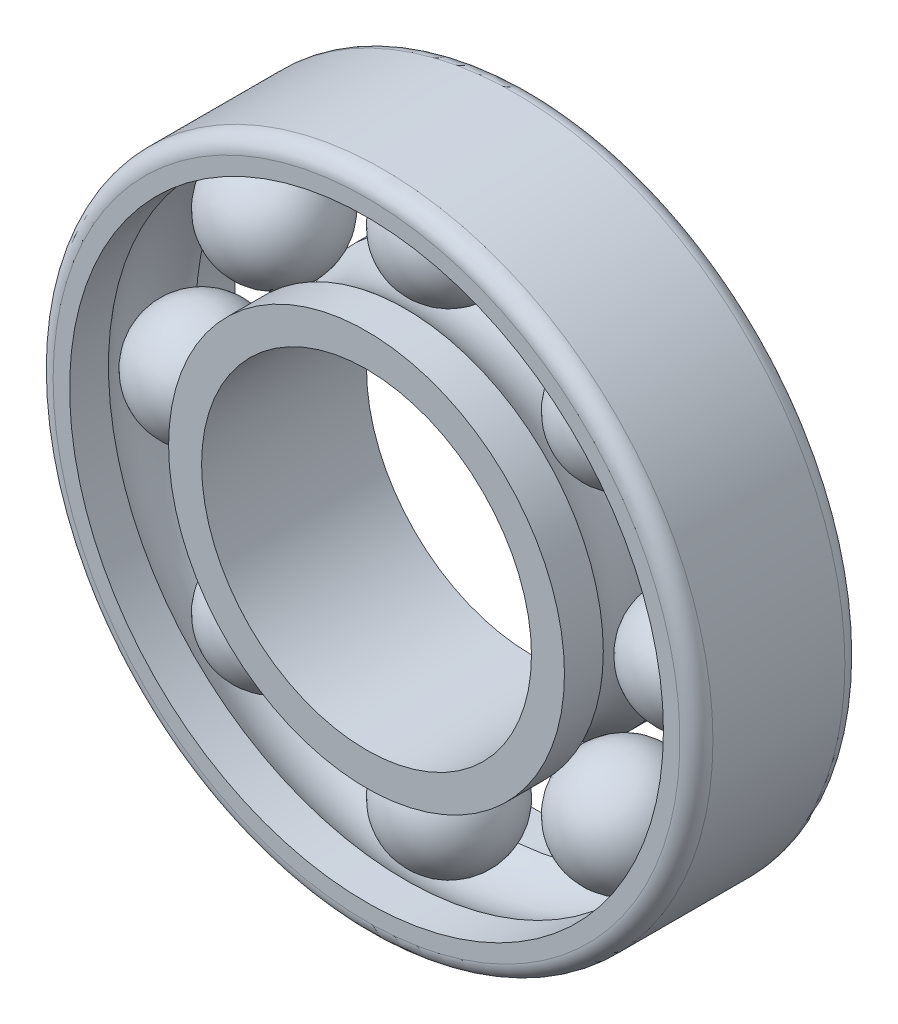
ISO-10303-21;
HEADER;
FILE_DESCRIPTION(('STEP AP214'),'2;1');
FILE_NAME('part.step','',(''),(''),'','','');
FILE_SCHEMA(('AUTOMOTIVE_DESIGN { 1 0 10303 214 1 1 1 1 }'));
ENDSEC;
DATA;
#1=APPLICATION_CONTEXT('core data for automotive mechanical design processes');
#2=APPLICATION_PROTOCOL_DEFINITION('international standard','automotive_design',2000,#1);
#3=PRODUCT_CONTEXT('',#1,'mechanical');
#4=PRODUCT('Part','Part','',(#3));
#5=PRODUCT_RELATED_PRODUCT_CATEGORY('part','',(#4));
#6=PRODUCT_DEFINITION_FORMATION('','',#4);
#7=PRODUCT_DEFINITION_CONTEXT('part definition',#1,'design');
#8=PRODUCT_DEFINITION('design','',#6,#7);
#9=PRODUCT_DEFINITION_SHAPE('','',#8);
#10=(LENGTH_UNIT() NAMED_UNIT(*) SI_UNIT(.MILLI.,.METRE.));
#11=(NAMED_UNIT(*) PLANE_ANGLE_UNIT() SI_UNIT($,.RADIAN.));
#12=(NAMED_UNIT(*) SI_UNIT($,.STERADIAN.) SOLID_ANGLE_UNIT());
#13=UNCERTAINTY_MEASURE_WITH_UNIT(LENGTH_MEASURE(1.E-05),#10,'distance_accuracy_value','');
#14=(GEOMETRIC_REPRESENTATION_CONTEXT(3) GLOBAL_UNCERTAINTY_ASSIGNED_CONTEXT((#13)) GLOBAL_UNIT_ASSIGNED_CONTEXT((#10,
#11,#12)) REPRESENTATION_CONTEXT('',''));
#15=CARTESIAN_POINT('',(0.,0.,0.));
#16=DIRECTION('',(0.,0.,1.));
#17=DIRECTION('',(1.,0.,0.));
#18=AXIS2_PLACEMENT_3D('',#15,#16,#17);
#19=CARTESIAN_POINT('',(-1.06066017177983,-1.06066017177981,0.));
#20=DIRECTION('',(0.,0.,-1.));
#21=DIRECTION('',(0.707106781186556,0.707106781186539,0.));
#22=AXIS2_PLACEMENT_3D('',#19,#20,#21);
#23=SPHERICAL_SURFACE('',#22,0.354562900648627);
#24=CARTESIAN_POINT('',(-1.06066017177983,-1.06066017177981,-0.354562900648627));
#25=VERTEX_POINT('',#24);
#26=VERTEX_LOOP('',#25);
#27=FACE_BOUND('',#26,.T.);
#28=ADVANCED_FACE('F48',(#27),#23,.T.);
#29=CLOSED_SHELL('',(#28));
#30=MANIFOLD_SOLID_BREP('B2',#29);
#31=CARTESIAN_POINT('',(0.,-1.5,0.));
#32=DIRECTION('',(0.,0.,-1.));
#33=DIRECTION('',(0.,1.,0.));
#34=AXIS2_PLACEMENT_3D('',#31,#32,#33);
#35=SPHERICAL_SURFACE('',#34,0.354562900648627);
#36=CARTESIAN_POINT('',(0.,-1.5,-0.354562900648627));
#37=VERTEX_POINT('',#36);
#38=VERTEX_LOOP('',#37);
#39=FACE_BOUND('',#38,.T.);
#40=ADVANCED_FACE('F67',(#39),#35,.T.);
#41=CLOSED_SHELL('',(#40));
#42=MANIFOLD_SOLID_BREP('B6',#41);
#43=CARTESIAN_POINT('',(1.06066017177981,-1.06066017177983,0.));
#44=DIRECTION('',(0.,0.,-1.));
#45=DIRECTION('',(-0.707106781186541,0.707106781186554,0.));
#46=AXIS2_PLACEMENT_3D('',#43,#44,#45);
#47=SPHERICAL_SURFACE('',#46,0.354562900648627);
#48=CARTESIAN_POINT('',(1.06066017177981,-1.06066017177983,-0.354562900648627));
#49=VERTEX_POINT('',#48);
#50=VERTEX_LOOP('',#49);
#51=FACE_BOUND('',#50,.T.);
#52=ADVANCED_FACE('F86',(#51),#47,.T.);
#53=CLOSED_SHELL('',(#52));
#54=MANIFOLD_SOLID_BREP('B44',#53);
#55=CARTESIAN_POINT('',(1.5,0.,0.));
#56=DIRECTION('',(0.,0.,-1.));
#57=DIRECTION('',(-1.,0.,0.));
#58=AXIS2_PLACEMENT_3D('',#55,#56,#57);
#59=SPHERICAL_SURFACE('',#58,0.354562900648627);
#60=CARTESIAN_POINT('',(1.5,0.,-0.354562900648627));
#61=VERTEX_POINT('',#60);
#62=VERTEX_LOOP('',#61);
#63=FACE_BOUND('',#62,.T.);
#64=ADVANCED_FACE('F105',(#63),#59,.T.);
#65=CLOSED_SHELL('',(#64));
#66=MANIFOLD_SOLID_BREP('B63',#65);
#67=CARTESIAN_POINT('',(1.06066017177983,1.06066017177982,0.));
#68=DIRECTION('',(0.,0.,-1.));
#69=DIRECTION('',(-0.707106781186551,-0.707106781186544,0.));
#70=AXIS2_PLACEMENT_3D('',#67,#68,#69);
#71=SPHERICAL_SURFACE('',#70,0.354562900648627);
#72=CARTESIAN_POINT('',(1.06066017177983,1.06066017177982,-0.354562900648627));
#73=VERTEX_POINT('',#72);
#74=VERTEX_LOOP('',#73);
#75=FACE_BOUND('',#74,.T.);
#76=ADVANCED_FACE('F124',(#75),#71,.T.);
#77=CLOSED_SHELL('',(#76));
#78=MANIFOLD_SOLID_BREP('B82',#77);
#79=CARTESIAN_POINT('',(0.,1.5,0.));
#80=DIRECTION('',(0.,0.,-1.));
#81=DIRECTION('',(0.,-1.,0.));
#82=AXIS2_PLACEMENT_3D('',#79,#80,#81);
#83=SPHERICAL_SURFACE('',#82,0.354562900648627);
#84=CARTESIAN_POINT('',(0.,1.5,-0.354562900648627));
#85=VERTEX_POINT('',#84);
#86=VERTEX_LOOP('',#85);
#87=FACE_BOUND('',#86,.T.);
#88=ADVANCED_FACE('F143',(#87),#83,.T.);
#89=CLOSED_SHELL('',(#88));
#90=MANIFOLD_SOLID_BREP('B101',#89);
#91=CARTESIAN_POINT('',(-1.06066017177982,1.06066017177982,0.));
#92=DIRECTION('',(0.,0.,-1.));
#93=DIRECTION('',(0.707106781186546,-0.707106781186549,0.));
#94=AXIS2_PLACEMENT_3D('',#91,#92,#93);
#95=SPHERICAL_SURFACE('',#94,0.354562900648627);
#96=CARTESIAN_POINT('',(-1.06066017177982,1.06066017177982,-0.354562900648627));
#97=VERTEX_POINT('',#96);
#98=VERTEX_LOOP('',#97);
#99=FACE_BOUND('',#98,.T.);
#100=ADVANCED_FACE('F164',(#99),#95,.T.);
#101=CLOSED_SHELL('',(#100));
#102=MANIFOLD_SOLID_BREP('B120',#101);
#103=CARTESIAN_POINT('',(0.,0.,0.));
#104=DIRECTION('',(0.,0.,1.));
#105=DIRECTION('',(1.,0.,0.));
#106=AXIS2_PLACEMENT_3D('',#103,#104,#105);
#107=CYLINDRICAL_SURFACE('',#106,2.);
#108=CARTESIAN_POINT('',(0.,0.,0.4));
#109=DIRECTION('',(0.,0.,-1.));
#110=DIRECTION('',(-1.,0.,0.));
#111=AXIS2_PLACEMENT_3D('',#108,#109,#110);
#112=CIRCLE('',#111,2.);
#113=CARTESIAN_POINT('',(-2.,0.,0.4));
#114=VERTEX_POINT('',#113);
#115=EDGE_CURVE('E163',#114,#114,#112,.T.);
#116=ORIENTED_EDGE('',*,*,#115,.T.);
#117=EDGE_LOOP('',(#116));
#118=FACE_BOUND('',#117,.T.);
#119=CARTESIAN_POINT('',(0.,0.,-0.4));
#120=DIRECTION('',(0.,0.,1.));
#121=DIRECTION('',(1.,0.,0.));
#122=AXIS2_PLACEMENT_3D('',#119,#120,#121);
#123=CIRCLE('',#122,2.);
#124=CARTESIAN_POINT('',(2.,0.,-0.4));
#125=VERTEX_POINT('',#124);
#126=EDGE_CURVE('E200',#125,#125,#123,.T.);
#127=ORIENTED_EDGE('',*,*,#126,.T.);
#128=EDGE_LOOP('',(#127));
#129=FACE_BOUND('',#128,.T.);
#130=ADVANCED_FACE('F185',(#118,#129),#107,.T.);
#131=CARTESIAN_POINT('',(-1.8,0.,0.5));
#132=DIRECTION('',(0.,0.,-1.));
#133=DIRECTION('',(-1.,0.,0.));
#134=AXIS2_PLACEMENT_3D('',#131,#132,#133);
#135=PLANE('',#134);
#136=CARTESIAN_POINT('',(0.,0.,0.5));
#137=DIRECTION('',(0.,0.,-1.));
#138=DIRECTION('',(-1.,0.,0.));
#139=AXIS2_PLACEMENT_3D('',#136,#137,#138);
#140=CIRCLE('',#139,1.9);
#141=CARTESIAN_POINT('',(-1.9,0.,0.5));
#142=VERTEX_POINT('',#141);
#143=EDGE_CURVE('E192',#142,#142,#140,.F.);
#144=ORIENTED_EDGE('',*,*,#143,.T.);
#145=EDGE_LOOP('',(#144));
#146=FACE_BOUND('',#145,.T.);
#147=CARTESIAN_POINT('',(0.,0.,0.5));
#148=DIRECTION('',(0.,0.,1.));
#149=DIRECTION('',(1.,0.,0.));
#150=AXIS2_PLACEMENT_3D('',#147,#148,#149);
#151=CIRCLE('',#150,1.8);
#152=CARTESIAN_POINT('',(1.8,0.,0.5));
#153=VERTEX_POINT('',#152);
#154=EDGE_CURVE('E205',#153,#153,#151,.T.);
#155=ORIENTED_EDGE('',*,*,#154,.F.);
#156=EDGE_LOOP('',(#155));
#157=FACE_BOUND('',#156,.T.);
#158=ADVANCED_FACE('F235',(#146,#157),#135,.F.);
#159=CARTESIAN_POINT('',(0.,0.,0.));
#160=DIRECTION('',(0.,0.,1.));
#161=DIRECTION('',(1.,0.,0.));
#162=AXIS2_PLACEMENT_3D('',#159,#160,#161);
#163=CYLINDRICAL_SURFACE('',#162,1.8);
#164=CARTESIAN_POINT('',(0.,0.,0.264575131106459));
#165=DIRECTION('',(0.,0.,1.));
#166=DIRECTION('',(1.,0.,0.));
#167=AXIS2_PLACEMENT_3D('',#164,#165,#166);
#168=CIRCLE('',#167,1.8);
#169=CARTESIAN_POINT('',(1.8,0.,0.264575131106459));
#170=VERTEX_POINT('',#169);
#171=EDGE_CURVE('E208',#170,#170,#168,.T.);
#172=ORIENTED_EDGE('',*,*,#171,.F.);
#173=EDGE_LOOP('',(#172));
#174=FACE_BOUND('',#173,.T.);
#175=ORIENTED_EDGE('',*,*,#154,.T.);
#176=EDGE_LOOP('',(#175));
#177=FACE_BOUND('',#176,.T.);
#178=ADVANCED_FACE('F229',(#174,#177),#163,.F.);
#179=CARTESIAN_POINT('',(0.,0.,0.));
#180=DIRECTION('',(0.,0.,1.));
#181=DIRECTION('',(1.,0.,0.));
#182=AXIS2_PLACEMENT_3D('',#179,#180,#181);
#183=TOROIDAL_SURFACE('',#182,1.5,0.4);
#184=CARTESIAN_POINT('',(0.,0.,-0.264575131106459));
#185=DIRECTION('',(0.,0.,1.));
#186=DIRECTION('',(1.,0.,0.));
#187=AXIS2_PLACEMENT_3D('',#184,#185,#186);
#188=CIRCLE('',#187,1.8);
#189=CARTESIAN_POINT('',(1.8,0.,-0.264575131106459));
#190=VERTEX_POINT('',#189);
#191=EDGE_CURVE('E211',#190,#190,#188,.T.);
#192=ORIENTED_EDGE('',*,*,#191,.F.);
#193=EDGE_LOOP('',(#192));
#194=FACE_BOUND('',#193,.T.);
#195=ORIENTED_EDGE('',*,*,#171,.T.);
#196=EDGE_LOOP('',(#195));
#197=FACE_BOUND('',#196,.T.);
#198=ADVANCED_FACE('F223',(#194,#197),#183,.F.);
#199=CARTESIAN_POINT('',(0.,0.,0.));
#200=DIRECTION('',(0.,0.,1.));
#201=DIRECTION('',(1.,0.,0.));
#202=AXIS2_PLACEMENT_3D('',#199,#200,#201);
#203=CYLINDRICAL_SURFACE('',#202,1.8);
#204=CARTESIAN_POINT('',(0.,0.,-0.5));
#205=DIRECTION('',(0.,0.,1.));
#206=DIRECTION('',(1.,0.,0.));
#207=AXIS2_PLACEMENT_3D('',#204,#205,#206);
#208=CIRCLE('',#207,1.8);
#209=CARTESIAN_POINT('',(1.8,0.,-0.5));
#210=VERTEX_POINT('',#209);
#211=EDGE_CURVE('E214',#210,#210,#208,.T.);
#212=ORIENTED_EDGE('',*,*,#211,.F.);
#213=EDGE_LOOP('',(#212));
#214=FACE_BOUND('',#213,.T.);
#215=ORIENTED_EDGE('',*,*,#191,.T.);
#216=EDGE_LOOP('',(#215));
#217=FACE_BOUND('',#216,.T.);
#218=ADVANCED_FACE('F220',(#214,#217),#203,.F.);
#219=CARTESIAN_POINT('',(-1.8,0.,-0.5));
#220=DIRECTION('',(0.,0.,1.));
#221=DIRECTION('',(1.,0.,0.));
#222=AXIS2_PLACEMENT_3D('',#219,#220,#221);
#223=PLANE('',#222);
#224=CARTESIAN_POINT('',(0.,0.,-0.5));
#225=DIRECTION('',(0.,0.,1.));
#226=DIRECTION('',(1.,0.,0.));
#227=AXIS2_PLACEMENT_3D('',#224,#225,#226);
#228=CIRCLE('',#227,1.9);
#229=CARTESIAN_POINT('',(1.9,0.,-0.5));
#230=VERTEX_POINT('',#229);
#231=EDGE_CURVE('E196',#230,#230,#228,.F.);
#232=ORIENTED_EDGE('',*,*,#231,.T.);
#233=EDGE_LOOP('',(#232));
#234=FACE_BOUND('',#233,.T.);
#235=ORIENTED_EDGE('',*,*,#211,.T.);
#236=EDGE_LOOP('',(#235));
#237=FACE_BOUND('',#236,.T.);
#238=ADVANCED_FACE('F218',(#234,#237),#223,.F.);
#239=CARTESIAN_POINT('',(0.,0.,-0.4));
#240=DIRECTION('',(0.,0.,1.));
#241=DIRECTION('',(1.,0.,0.));
#242=AXIS2_PLACEMENT_3D('',#239,#240,#241);
#243=TOROIDAL_SURFACE('',#242,1.9,0.1);
#244=ORIENTED_EDGE('',*,*,#231,.F.);
#245=EDGE_LOOP('',(#244));
#246=FACE_BOUND('',#245,.T.);
#247=ORIENTED_EDGE('',*,*,#126,.F.);
#248=EDGE_LOOP('',(#247));
#249=FACE_BOUND('',#248,.T.);
#250=ADVANCED_FACE('F246',(#246,#249),#243,.T.);
#251=CARTESIAN_POINT('',(0.,0.,0.4));
#252=DIRECTION('',(0.,0.,-1.));
#253=DIRECTION('',(-1.,0.,0.));
#254=AXIS2_PLACEMENT_3D('',#251,#252,#253);
#255=TOROIDAL_SURFACE('',#254,1.9,0.1);
#256=ORIENTED_EDGE('',*,*,#115,.F.);
#257=EDGE_LOOP('',(#256));
#258=FACE_BOUND('',#257,.T.);
#259=ORIENTED_EDGE('',*,*,#143,.F.);
#260=EDGE_LOOP('',(#259));
#261=FACE_BOUND('',#260,.T.);
#262=ADVANCED_FACE('F187',(#258,#261),#255,.T.);
#263=CLOSED_SHELL('',(#130,#158,#178,#198,#218,#238,#250,#262));
#264=MANIFOLD_SOLID_BREP('B139',#263);
#265=CARTESIAN_POINT('',(0.,0.,0.));
#266=DIRECTION('',(0.,0.,1.));
#267=DIRECTION('',(1.,0.,0.));
#268=AXIS2_PLACEMENT_3D('',#265,#266,#267);
#269=CYLINDRICAL_SURFACE('',#268,1.2);
#270=CARTESIAN_POINT('',(0.,0.,0.5));
#271=DIRECTION('',(0.,0.,1.));
#272=DIRECTION('',(1.,0.,0.));
#273=AXIS2_PLACEMENT_3D('',#270,#271,#272);
#274=CIRCLE('',#273,1.2);
#275=CARTESIAN_POINT('',(1.2,0.,0.5));
#276=VERTEX_POINT('',#275);
#277=EDGE_CURVE('E184',#276,#276,#274,.T.);
#278=ORIENTED_EDGE('',*,*,#277,.F.);
#279=EDGE_LOOP('',(#278));
#280=FACE_BOUND('',#279,.T.);
#281=CARTESIAN_POINT('',(0.,0.,0.264575131106459));
#282=DIRECTION('',(0.,0.,1.));
#283=DIRECTION('',(1.,0.,0.));
#284=AXIS2_PLACEMENT_3D('',#281,#282,#283);
#285=CIRCLE('',#284,1.2);
#286=CARTESIAN_POINT('',(1.2,0.,0.264575131106459));
#287=VERTEX_POINT('',#286);
#288=EDGE_CURVE('E334',#287,#287,#285,.T.);
#289=ORIENTED_EDGE('',*,*,#288,.T.);
#290=EDGE_LOOP('',(#289));
#291=FACE_BOUND('',#290,.T.);
#292=ADVANCED_FACE('F312',(#280,#291),#269,.T.);
#293=CARTESIAN_POINT('',(-1.,0.,0.5));
#294=DIRECTION('',(0.,0.,-1.));
#295=DIRECTION('',(-1.,0.,0.));
#296=AXIS2_PLACEMENT_3D('',#293,#294,#295);
#297=PLANE('',#296);
#298=CARTESIAN_POINT('',(0.,0.,0.5));
#299=DIRECTION('',(0.,0.,1.));
#300=DIRECTION('',(1.,0.,0.));
#301=AXIS2_PLACEMENT_3D('',#298,#299,#300);
#302=CIRCLE('',#301,1.);
#303=CARTESIAN_POINT('',(1.,0.,0.5));
#304=VERTEX_POINT('',#303);
#305=EDGE_CURVE('E318',#304,#304,#302,.T.);
#306=ORIENTED_EDGE('',*,*,#305,.F.);
#307=EDGE_LOOP('',(#306));
#308=FACE_BOUND('',#307,.T.);
#309=ORIENTED_EDGE('',*,*,#277,.T.);
#310=EDGE_LOOP('',(#309));
#311=FACE_BOUND('',#310,.T.);
#312=ADVANCED_FACE('F359',(#308,#311),#297,.F.);
#313=CARTESIAN_POINT('',(0.,0.,0.));
#314=DIRECTION('',(0.,0.,1.));
#315=DIRECTION('',(1.,0.,0.));
#316=AXIS2_PLACEMENT_3D('',#313,#314,#315);
#317=CYLINDRICAL_SURFACE('',#316,1.);
#318=CARTESIAN_POINT('',(0.,0.,-0.5));
#319=DIRECTION('',(0.,0.,1.));
#320=DIRECTION('',(1.,0.,0.));
#321=AXIS2_PLACEMENT_3D('',#318,#319,#320);
#322=CIRCLE('',#321,1.);
#323=CARTESIAN_POINT('',(1.,0.,-0.5));
#324=VERTEX_POINT('',#323);
#325=EDGE_CURVE('E322',#324,#324,#322,.T.);
#326=ORIENTED_EDGE('',*,*,#325,.F.);
#327=EDGE_LOOP('',(#326));
#328=FACE_BOUND('',#327,.T.);
#329=ORIENTED_EDGE('',*,*,#305,.T.);
#330=EDGE_LOOP('',(#329));
#331=FACE_BOUND('',#330,.T.);
#332=ADVANCED_FACE('F354',(#328,#331),#317,.F.);
#333=CARTESIAN_POINT('',(-1.,0.,-0.5));
#334=DIRECTION('',(0.,0.,1.));
#335=DIRECTION('',(1.,0.,0.));
#336=AXIS2_PLACEMENT_3D('',#333,#334,#335);
#337=PLANE('',#336);
#338=CARTESIAN_POINT('',(0.,0.,-0.5));
#339=DIRECTION('',(0.,0.,1.));
#340=DIRECTION('',(1.,0.,0.));
#341=AXIS2_PLACEMENT_3D('',#338,#339,#340);
#342=CIRCLE('',#341,1.2);
#343=CARTESIAN_POINT('',(1.2,0.,-0.5));
#344=VERTEX_POINT('',#343);
#345=EDGE_CURVE('E326',#344,#344,#342,.T.);
#346=ORIENTED_EDGE('',*,*,#345,.F.);
#347=EDGE_LOOP('',(#346));
#348=FACE_BOUND('',#347,.T.);
#349=ORIENTED_EDGE('',*,*,#325,.T.);
#350=EDGE_LOOP('',(#349));
#351=FACE_BOUND('',#350,.T.);
#352=ADVANCED_FACE('F348',(#348,#351),#337,.F.);
#353=CARTESIAN_POINT('',(0.,0.,0.));
#354=DIRECTION('',(0.,0.,1.));
#355=DIRECTION('',(1.,0.,0.));
#356=AXIS2_PLACEMENT_3D('',#353,#354,#355);
#357=CYLINDRICAL_SURFACE('',#356,1.2);
#358=CARTESIAN_POINT('',(0.,0.,-0.264575131106459));
#359=DIRECTION('',(0.,0.,1.));
#360=DIRECTION('',(1.,0.,0.));
#361=AXIS2_PLACEMENT_3D('',#358,#359,#360);
#362=CIRCLE('',#361,1.2);
#363=CARTESIAN_POINT('',(1.2,0.,-0.264575131106459));
#364=VERTEX_POINT('',#363);
#365=EDGE_CURVE('E331',#364,#364,#362,.T.);
#366=ORIENTED_EDGE('',*,*,#365,.F.);
#367=EDGE_LOOP('',(#366));
#368=FACE_BOUND('',#367,.T.);
#369=ORIENTED_EDGE('',*,*,#345,.T.);
#370=EDGE_LOOP('',(#369));
#371=FACE_BOUND('',#370,.T.);
#372=ADVANCED_FACE('F342',(#368,#371),#357,.T.);
#373=CARTESIAN_POINT('',(0.,0.,0.));
#374=DIRECTION('',(0.,0.,1.));
#375=DIRECTION('',(1.,0.,0.));
#376=AXIS2_PLACEMENT_3D('',#373,#374,#375);
#377=TOROIDAL_SURFACE('',#376,1.5,0.4);
#378=ORIENTED_EDGE('',*,*,#288,.F.);
#379=EDGE_LOOP('',(#378));
#380=FACE_BOUND('',#379,.T.);
#381=ORIENTED_EDGE('',*,*,#365,.T.);
#382=EDGE_LOOP('',(#381));
#383=FACE_BOUND('',#382,.T.);
#384=ADVANCED_FACE('F339',(#380,#383),#377,.F.);
#385=CLOSED_SHELL('',(#292,#312,#332,#352,#372,#384));
#386=MANIFOLD_SOLID_BREP('B158',#385);
#387=CARTESIAN_POINT('',(-1.5,0.,0.));
#388=DIRECTION('',(0.,0.,-1.));
#389=DIRECTION('',(1.,0.,0.));
#390=AXIS2_PLACEMENT_3D('',#387,#388,#389);
#391=SPHERICAL_SURFACE('',#390,0.354562900648627);
#392=CARTESIAN_POINT('',(-1.5,0.,-0.354562900648627));
#393=VERTEX_POINT('',#392);
#394=VERTEX_LOOP('',#393);
#395=FACE_BOUND('',#394,.T.);
#396=ADVANCED_FACE('F404',(#395),#391,.T.);
#397=CLOSED_SHELL('',(#396));
#398=MANIFOLD_SOLID_BREP('B179',#397);
#399=ADVANCED_BREP_SHAPE_REPRESENTATION('',(#18,#30,#42,#54,#66,#78,#90,#102,#264,#386,#398),#14);
#400=SHAPE_DEFINITION_REPRESENTATION(#9,#399);
ENDSEC;
END-ISO-10303-21;
